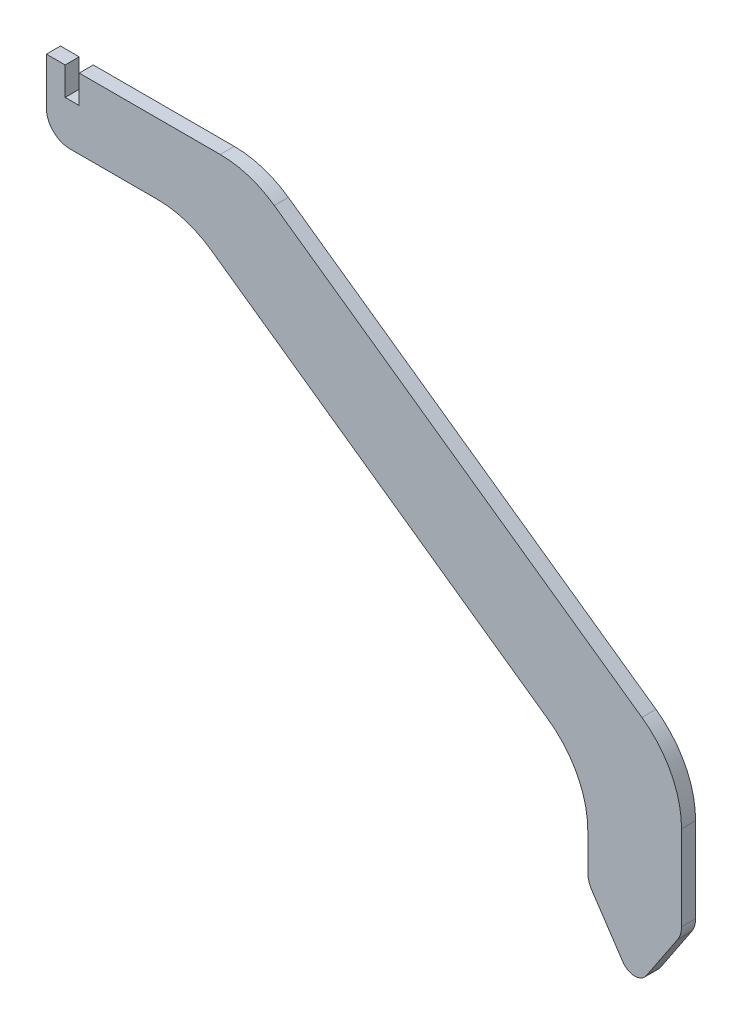
ISO-10303-21;
HEADER;
FILE_DESCRIPTION(('STEP AP214'),'2;1');
FILE_NAME('part.step','',(''),(''),'','','');
FILE_SCHEMA(('AUTOMOTIVE_DESIGN { 1 0 10303 214 1 1 1 1 }'));
ENDSEC;
DATA;
#1=APPLICATION_CONTEXT('core data for automotive mechanical design processes');
#2=APPLICATION_PROTOCOL_DEFINITION('international standard','automotive_design',2000,#1);
#3=PRODUCT_CONTEXT('',#1,'mechanical');
#4=PRODUCT('Part','Part','',(#3));
#5=PRODUCT_RELATED_PRODUCT_CATEGORY('part','',(#4));
#6=PRODUCT_DEFINITION_FORMATION('','',#4);
#7=PRODUCT_DEFINITION_CONTEXT('part definition',#1,'design');
#8=PRODUCT_DEFINITION('design','',#6,#7);
#9=PRODUCT_DEFINITION_SHAPE('','',#8);
#10=(LENGTH_UNIT() NAMED_UNIT(*) SI_UNIT(.MILLI.,.METRE.));
#11=(NAMED_UNIT(*) PLANE_ANGLE_UNIT() SI_UNIT($,.RADIAN.));
#12=(NAMED_UNIT(*) SI_UNIT($,.STERADIAN.) SOLID_ANGLE_UNIT());
#13=UNCERTAINTY_MEASURE_WITH_UNIT(LENGTH_MEASURE(1.E-05),#10,'distance_accuracy_value','');
#14=(GEOMETRIC_REPRESENTATION_CONTEXT(3) GLOBAL_UNCERTAINTY_ASSIGNED_CONTEXT((#13)) GLOBAL_UNIT_ASSIGNED_CONTEXT((#10,
#11,#12)) REPRESENTATION_CONTEXT('',''));
#15=CARTESIAN_POINT('',(0.,0.,0.));
#16=DIRECTION('',(0.,0.,1.));
#17=DIRECTION('',(1.,0.,0.));
#18=AXIS2_PLACEMENT_3D('',#15,#16,#17);
#19=CARTESIAN_POINT('',(0.,-1.5,0.15));
#20=DIRECTION('',(1.,0.,0.));
#21=DIRECTION('',(0.,0.,-1.));
#22=AXIS2_PLACEMENT_3D('',#19,#20,#21);
#23=PLANE('',#22);
#24=DIRECTION('',(0.,-1.,0.));
#25=VECTOR('',#24,1.);
#26=CARTESIAN_POINT('',(0.,-1.5,-0.15));
#27=LINE('',#26,#25);
#28=CARTESIAN_POINT('',(0.,0.,-0.15));
#29=VERTEX_POINT('',#28);
#30=CARTESIAN_POINT('',(0.,-1.,-0.15));
#31=VERTEX_POINT('',#30);
#32=EDGE_CURVE('E221',#29,#31,#27,.T.);
#33=ORIENTED_EDGE('',*,*,#32,.T.);
#34=DIRECTION('',(0.,0.,-1.));
#35=VECTOR('',#34,1.);
#36=CARTESIAN_POINT('',(0.,-1.,0.15));
#37=LINE('',#36,#35);
#38=CARTESIAN_POINT('',(0.,-1.,0.15));
#39=VERTEX_POINT('',#38);
#40=EDGE_CURVE('E289',#31,#39,#37,.F.);
#41=ORIENTED_EDGE('',*,*,#40,.T.);
#42=DIRECTION('',(0.,-1.,0.));
#43=VECTOR('',#42,1.);
#44=CARTESIAN_POINT('',(0.,-1.5,0.15));
#45=LINE('',#44,#43);
#46=CARTESIAN_POINT('',(0.,0.,0.15));
#47=VERTEX_POINT('',#46);
#48=EDGE_CURVE('E256',#47,#39,#45,.T.);
#49=ORIENTED_EDGE('',*,*,#48,.F.);
#50=DIRECTION('',(0.,0.,-1.));
#51=VECTOR('',#50,1.);
#52=CARTESIAN_POINT('',(0.,0.,0.15));
#53=LINE('',#52,#51);
#54=EDGE_CURVE('E220',#47,#29,#53,.T.);
#55=ORIENTED_EDGE('',*,*,#54,.T.);
#56=EDGE_LOOP('',(#33,#41,#49,#55));
#57=FACE_BOUND('',#56,.T.);
#58=ADVANCED_FACE('F37',(#57),#23,.F.);
#59=CARTESIAN_POINT('',(3.,-1.5,0.15));
#60=DIRECTION('',(0.,1.,0.));
#61=DIRECTION('',(-1.,0.,0.));
#62=AXIS2_PLACEMENT_3D('',#59,#60,#61);
#63=PLANE('',#62);
#64=DIRECTION('',(1.,0.,0.));
#65=VECTOR('',#64,1.);
#66=CARTESIAN_POINT('',(3.,-1.5,-0.15));
#67=LINE('',#66,#65);
#68=CARTESIAN_POINT('',(0.5,-1.5,-0.15));
#69=VERTEX_POINT('',#68);
#70=CARTESIAN_POINT('',(2.36514507852952,-1.5,-0.15));
#71=VERTEX_POINT('',#70);
#72=EDGE_CURVE('E225',#69,#71,#67,.T.);
#73=ORIENTED_EDGE('',*,*,#72,.T.);
#74=DIRECTION('',(0.,0.,-1.));
#75=VECTOR('',#74,1.);
#76=CARTESIAN_POINT('',(2.36514507852952,-1.5,0.15));
#77=LINE('',#76,#75);
#78=CARTESIAN_POINT('',(2.36514507852952,-1.5,0.15));
#79=VERTEX_POINT('',#78);
#80=EDGE_CURVE('E332',#71,#79,#77,.F.);
#81=ORIENTED_EDGE('',*,*,#80,.T.);
#82=DIRECTION('',(1.,0.,0.));
#83=VECTOR('',#82,1.);
#84=CARTESIAN_POINT('',(3.,-1.5,0.15));
#85=LINE('',#84,#83);
#86=CARTESIAN_POINT('',(0.5,-1.5,0.15));
#87=VERTEX_POINT('',#86);
#88=EDGE_CURVE('E351',#87,#79,#85,.T.);
#89=ORIENTED_EDGE('',*,*,#88,.F.);
#90=DIRECTION('',(0.,0.,-1.));
#91=VECTOR('',#90,1.);
#92=CARTESIAN_POINT('',(0.5,-1.5,0.15));
#93=LINE('',#92,#91);
#94=EDGE_CURVE('E278',#87,#69,#93,.T.);
#95=ORIENTED_EDGE('',*,*,#94,.T.);
#96=EDGE_LOOP('',(#73,#81,#89,#95));
#97=FACE_BOUND('',#96,.T.);
#98=ADVANCED_FACE('F344',(#97),#63,.F.);
#99=CARTESIAN_POINT('',(11.55,-7.5362202999531,0.15));
#100=DIRECTION('',(0.5767422601275,0.816926168869025,0.));
#101=DIRECTION('',(-0.816926168869025,0.5767422601275,0.));
#102=AXIS2_PLACEMENT_3D('',#99,#100,#101);
#103=PLANE('',#102);
#104=DIRECTION('',(0.816926168869025,-0.5767422601275,0.));
#105=VECTOR('',#104,1.);
#106=CARTESIAN_POINT('',(11.55,-7.5362202999531,-0.15));
#107=LINE('',#106,#105);
#108=CARTESIAN_POINT('',(3.51862959878452,-1.86614766226195,-0.15));
#109=VERTEX_POINT('',#108);
#110=CARTESIAN_POINT('',(10.703484520255,-6.93858826216815,-0.15));
#111=VERTEX_POINT('',#110);
#112=EDGE_CURVE('E228',#109,#111,#107,.T.);
#113=ORIENTED_EDGE('',*,*,#112,.T.);
#114=DIRECTION('',(0.,0.,-1.));
#115=VECTOR('',#114,1.);
#116=CARTESIAN_POINT('',(10.703484520255,-6.93858826216815,0.15));
#117=LINE('',#116,#115);
#118=CARTESIAN_POINT('',(10.703484520255,-6.93858826216815,0.15));
#119=VERTEX_POINT('',#118);
#120=EDGE_CURVE('E330',#111,#119,#117,.F.);
#121=ORIENTED_EDGE('',*,*,#120,.T.);
#122=DIRECTION('',(0.816926168869025,-0.5767422601275,0.));
#123=VECTOR('',#122,1.);
#124=CARTESIAN_POINT('',(11.55,-7.5362202999531,0.15));
#125=LINE('',#124,#123);
#126=CARTESIAN_POINT('',(3.51862959878452,-1.86614766226195,0.15));
#127=VERTEX_POINT('',#126);
#128=EDGE_CURVE('E350',#127,#119,#125,.T.);
#129=ORIENTED_EDGE('',*,*,#128,.F.);
#130=DIRECTION('',(0.,0.,-1.));
#131=VECTOR('',#130,1.);
#132=CARTESIAN_POINT('',(3.51862959878452,-1.86614766226195,-0.15));
#133=LINE('',#132,#131);
#134=EDGE_CURVE('E327',#127,#109,#133,.T.);
#135=ORIENTED_EDGE('',*,*,#134,.T.);
#136=EDGE_LOOP('',(#113,#121,#129,#135));
#137=FACE_BOUND('',#136,.T.);
#138=ADVANCED_FACE('F353',(#137),#103,.F.);
#139=CARTESIAN_POINT('',(11.55,-9.5,0.15));
#140=DIRECTION('',(1.,0.,0.));
#141=DIRECTION('',(0.,0.,-1.));
#142=AXIS2_PLACEMENT_3D('',#139,#140,#141);
#143=PLANE('',#142);
#144=DIRECTION('',(0.,-1.,0.));
#145=VECTOR('',#144,1.);
#146=CARTESIAN_POINT('',(11.55,-9.5,0.15));
#147=LINE('',#146,#145);
#148=CARTESIAN_POINT('',(11.55,-8.5724405999062,0.15));
#149=VERTEX_POINT('',#148);
#150=CARTESIAN_POINT('',(11.55,-9.348612181134,0.15));
#151=VERTEX_POINT('',#150);
#152=EDGE_CURVE('E355',#149,#151,#147,.T.);
#153=ORIENTED_EDGE('',*,*,#152,.F.);
#154=DIRECTION('',(0.,0.,-1.));
#155=VECTOR('',#154,1.);
#156=CARTESIAN_POINT('',(11.55,-8.5724405999062,-0.15));
#157=LINE('',#156,#155);
#158=CARTESIAN_POINT('',(11.55,-8.5724405999062,-0.15));
#159=VERTEX_POINT('',#158);
#160=EDGE_CURVE('E324',#149,#159,#157,.T.);
#161=ORIENTED_EDGE('',*,*,#160,.T.);
#162=DIRECTION('',(0.,-1.,0.));
#163=VECTOR('',#162,1.);
#164=CARTESIAN_POINT('',(11.55,-9.5,-0.15));
#165=LINE('',#164,#163);
#166=CARTESIAN_POINT('',(11.55,-9.348612181134,-0.15));
#167=VERTEX_POINT('',#166);
#168=EDGE_CURVE('E231',#159,#167,#165,.T.);
#169=ORIENTED_EDGE('',*,*,#168,.T.);
#170=DIRECTION('',(0.,0.,-1.));
#171=VECTOR('',#170,1.);
#172=CARTESIAN_POINT('',(11.55,-9.348612181134,0.15));
#173=LINE('',#172,#171);
#174=EDGE_CURVE('E306',#167,#151,#173,.F.);
#175=ORIENTED_EDGE('',*,*,#174,.T.);
#176=EDGE_LOOP('',(#153,#161,#169,#175));
#177=FACE_BOUND('',#176,.T.);
#178=ADVANCED_FACE('F419',(#177),#143,.F.);
#179=CARTESIAN_POINT('',(12.55,-11.,0.15));
#180=DIRECTION('',(0.832050294337844,0.554700196225229,0.));
#181=DIRECTION('',(-0.554700196225229,0.832050294337844,0.));
#182=AXIS2_PLACEMENT_3D('',#179,#180,#181);
#183=PLANE('',#182);
#184=DIRECTION('',(0.554700196225229,-0.832050294337844,0.));
#185=VECTOR('',#184,1.);
#186=CARTESIAN_POINT('',(12.55,-11.,0.15));
#187=LINE('',#186,#185);
#188=CARTESIAN_POINT('',(11.6339748528311,-9.62596227924662,0.15));
#189=VERTEX_POINT('',#188);
#190=CARTESIAN_POINT('',(12.3003849116986,-10.625577367548,0.15));
#191=VERTEX_POINT('',#190);
#192=EDGE_CURVE('E357',#189,#191,#187,.T.);
#193=ORIENTED_EDGE('',*,*,#192,.F.);
#194=DIRECTION('',(0.,0.,-1.));
#195=VECTOR('',#194,1.);
#196=CARTESIAN_POINT('',(11.6339748528311,-9.62596227924662,0.15));
#197=LINE('',#196,#195);
#198=CARTESIAN_POINT('',(11.6339748528311,-9.62596227924662,-0.15));
#199=VERTEX_POINT('',#198);
#200=EDGE_CURVE('E303',#189,#199,#197,.T.);
#201=ORIENTED_EDGE('',*,*,#200,.T.);
#202=DIRECTION('',(0.554700196225229,-0.832050294337844,0.));
#203=VECTOR('',#202,1.);
#204=CARTESIAN_POINT('',(12.55,-11.,-0.15));
#205=LINE('',#204,#203);
#206=CARTESIAN_POINT('',(12.3003849116986,-10.625577367548,-0.15));
#207=VERTEX_POINT('',#206);
#208=EDGE_CURVE('E233',#199,#207,#205,.T.);
#209=ORIENTED_EDGE('',*,*,#208,.T.);
#210=DIRECTION('',(0.,0.,-1.));
#211=VECTOR('',#210,1.);
#212=CARTESIAN_POINT('',(12.3003849116986,-10.625577367548,0.15));
#213=LINE('',#212,#211);
#214=EDGE_CURVE('E273',#207,#191,#213,.F.);
#215=ORIENTED_EDGE('',*,*,#214,.T.);
#216=EDGE_LOOP('',(#193,#201,#209,#215));
#217=FACE_BOUND('',#216,.T.);
#218=ADVANCED_FACE('F422',(#217),#183,.F.);
#219=CARTESIAN_POINT('',(13.55,-9.5,0.15));
#220=DIRECTION('',(-0.832050294337844,0.554700196225229,0.));
#221=DIRECTION('',(-0.554700196225229,-0.832050294337844,0.));
#222=AXIS2_PLACEMENT_3D('',#219,#220,#221);
#223=PLANE('',#222);
#224=DIRECTION('',(0.554700196225229,0.832050294337844,0.));
#225=VECTOR('',#224,1.);
#226=CARTESIAN_POINT('',(13.55,-9.5,-0.15));
#227=LINE('',#226,#225);
#228=CARTESIAN_POINT('',(12.7996150883014,-10.625577367548,-0.15));
#229=VERTEX_POINT('',#228);
#230=CARTESIAN_POINT('',(13.4660251471689,-9.62596227924662,-0.15));
#231=VERTEX_POINT('',#230);
#232=EDGE_CURVE('E235',#229,#231,#227,.T.);
#233=ORIENTED_EDGE('',*,*,#232,.T.);
#234=DIRECTION('',(0.,0.,-1.));
#235=VECTOR('',#234,1.);
#236=CARTESIAN_POINT('',(13.4660251471689,-9.62596227924662,0.15));
#237=LINE('',#236,#235);
#238=CARTESIAN_POINT('',(13.4660251471689,-9.62596227924662,0.15));
#239=VERTEX_POINT('',#238);
#240=EDGE_CURVE('E301',#231,#239,#237,.F.);
#241=ORIENTED_EDGE('',*,*,#240,.T.);
#242=DIRECTION('',(0.554700196225229,0.832050294337844,0.));
#243=VECTOR('',#242,1.);
#244=CARTESIAN_POINT('',(13.55,-9.5,0.15));
#245=LINE('',#244,#243);
#246=CARTESIAN_POINT('',(12.7996150883014,-10.625577367548,0.15));
#247=VERTEX_POINT('',#246);
#248=EDGE_CURVE('E363',#247,#239,#245,.T.);
#249=ORIENTED_EDGE('',*,*,#248,.F.);
#250=DIRECTION('',(0.,0.,-1.));
#251=VECTOR('',#250,1.);
#252=CARTESIAN_POINT('',(12.7996150883014,-10.625577367548,0.15));
#253=LINE('',#252,#251);
#254=EDGE_CURVE('E205',#247,#229,#253,.T.);
#255=ORIENTED_EDGE('',*,*,#254,.T.);
#256=EDGE_LOOP('',(#233,#241,#249,#255));
#257=FACE_BOUND('',#256,.T.);
#258=ADVANCED_FACE('F426',(#257),#223,.F.);
#259=CARTESIAN_POINT('',(13.55,-6.5,0.15));
#260=DIRECTION('',(-1.,0.,0.));
#261=DIRECTION('',(0.,0.,1.));
#262=AXIS2_PLACEMENT_3D('',#259,#260,#261);
#263=PLANE('',#262);
#264=DIRECTION('',(0.,1.,0.));
#265=VECTOR('',#264,1.);
#266=CARTESIAN_POINT('',(13.55,-6.5,-0.15));
#267=LINE('',#266,#265);
#268=CARTESIAN_POINT('',(13.55,-9.348612181134,-0.15));
#269=VERTEX_POINT('',#268);
#270=CARTESIAN_POINT('',(13.55,-7.5362202999531,-0.15));
#271=VERTEX_POINT('',#270);
#272=EDGE_CURVE('E238',#269,#271,#267,.T.);
#273=ORIENTED_EDGE('',*,*,#272,.T.);
#274=DIRECTION('',(0.,0.,-1.));
#275=VECTOR('',#274,1.);
#276=CARTESIAN_POINT('',(13.55,-7.5362202999531,0.15));
#277=LINE('',#276,#275);
#278=CARTESIAN_POINT('',(13.55,-7.5362202999531,0.15));
#279=VERTEX_POINT('',#278);
#280=EDGE_CURVE('E52',#271,#279,#277,.F.);
#281=ORIENTED_EDGE('',*,*,#280,.T.);
#282=DIRECTION('',(0.,1.,0.));
#283=VECTOR('',#282,1.);
#284=CARTESIAN_POINT('',(13.55,-6.5,0.15));
#285=LINE('',#284,#283);
#286=CARTESIAN_POINT('',(13.55,-9.348612181134,0.15));
#287=VERTEX_POINT('',#286);
#288=EDGE_CURVE('E366',#287,#279,#285,.T.);
#289=ORIENTED_EDGE('',*,*,#288,.F.);
#290=DIRECTION('',(0.,0.,-1.));
#291=VECTOR('',#290,1.);
#292=CARTESIAN_POINT('',(13.55,-9.348612181134,0.15));
#293=LINE('',#292,#291);
#294=EDGE_CURVE('E298',#287,#269,#293,.T.);
#295=ORIENTED_EDGE('',*,*,#294,.T.);
#296=EDGE_LOOP('',(#273,#281,#289,#295));
#297=FACE_BOUND('',#296,.T.);
#298=ADVANCED_FACE('F430',(#297),#263,.F.);
#299=CARTESIAN_POINT('',(4.34307956993687,0.,0.15));
#300=DIRECTION('',(-0.5767422601275,-0.816926168869025,0.));
#301=DIRECTION('',(0.816926168869025,-0.5767422601275,0.));
#302=AXIS2_PLACEMENT_3D('',#299,#300,#301);
#303=PLANE('',#302);
#304=DIRECTION('',(-0.816926168869025,0.5767422601275,0.));
#305=VECTOR('',#304,1.);
#306=CARTESIAN_POINT('',(4.34307956993687,0.,-0.15));
#307=LINE('',#306,#305);
#308=CARTESIAN_POINT('',(12.703484520255,-5.90236796221505,-0.15));
#309=VERTEX_POINT('',#308);
#310=CARTESIAN_POINT('',(4.86170916872139,-0.36614766226195,-0.15));
#311=VERTEX_POINT('',#310);
#312=EDGE_CURVE('E240',#309,#311,#307,.T.);
#313=ORIENTED_EDGE('',*,*,#312,.T.);
#314=DIRECTION('',(0.,0.,-1.));
#315=VECTOR('',#314,1.);
#316=CARTESIAN_POINT('',(4.8617091687214,-0.36614766226195,0.15));
#317=LINE('',#316,#315);
#318=CARTESIAN_POINT('',(4.86170916872139,-0.36614766226195,0.15));
#319=VERTEX_POINT('',#318);
#320=EDGE_CURVE('E318',#311,#319,#317,.F.);
#321=ORIENTED_EDGE('',*,*,#320,.T.);
#322=DIRECTION('',(-0.816926168869025,0.5767422601275,0.));
#323=VECTOR('',#322,1.);
#324=CARTESIAN_POINT('',(4.34307956993687,0.,0.15));
#325=LINE('',#324,#323);
#326=CARTESIAN_POINT('',(12.703484520255,-5.90236796221505,0.15));
#327=VERTEX_POINT('',#326);
#328=EDGE_CURVE('E196',#327,#319,#325,.T.);
#329=ORIENTED_EDGE('',*,*,#328,.F.);
#330=DIRECTION('',(0.,0.,-1.));
#331=VECTOR('',#330,1.);
#332=CARTESIAN_POINT('',(12.703484520255,-5.90236796221505,0.15));
#333=LINE('',#332,#331);
#334=EDGE_CURVE('E315',#327,#309,#333,.T.);
#335=ORIENTED_EDGE('',*,*,#334,.T.);
#336=EDGE_LOOP('',(#313,#321,#329,#335));
#337=FACE_BOUND('',#336,.T.);
#338=ADVANCED_FACE('F434',(#337),#303,.F.);
#339=CARTESIAN_POINT('',(0.7,0.,0.15));
#340=DIRECTION('',(0.,-1.,0.));
#341=DIRECTION('',(0.,0.,-1.));
#342=AXIS2_PLACEMENT_3D('',#339,#340,#341);
#343=PLANE('',#342);
#344=DIRECTION('',(-1.,0.,0.));
#345=VECTOR('',#344,1.);
#346=CARTESIAN_POINT('',(0.7,0.,0.15));
#347=LINE('',#346,#345);
#348=CARTESIAN_POINT('',(3.70822464846639,0.,0.15));
#349=VERTEX_POINT('',#348);
#350=CARTESIAN_POINT('',(0.7,0.,0.15));
#351=VERTEX_POINT('',#350);
#352=EDGE_CURVE('E183',#349,#351,#347,.T.);
#353=ORIENTED_EDGE('',*,*,#352,.F.);
#354=DIRECTION('',(0.,0.,-1.));
#355=VECTOR('',#354,1.);
#356=CARTESIAN_POINT('',(3.70822464846639,0.,0.15));
#357=LINE('',#356,#355);
#358=CARTESIAN_POINT('',(3.70822464846639,0.,-0.15));
#359=VERTEX_POINT('',#358);
#360=EDGE_CURVE('E309',#349,#359,#357,.T.);
#361=ORIENTED_EDGE('',*,*,#360,.T.);
#362=DIRECTION('',(-1.,0.,0.));
#363=VECTOR('',#362,1.);
#364=CARTESIAN_POINT('',(0.7,0.,-0.15));
#365=LINE('',#364,#363);
#366=CARTESIAN_POINT('',(0.7,0.,-0.15));
#367=VERTEX_POINT('',#366);
#368=EDGE_CURVE('E202',#359,#367,#365,.T.);
#369=ORIENTED_EDGE('',*,*,#368,.T.);
#370=DIRECTION('',(0.,0.,-1.));
#371=VECTOR('',#370,1.);
#372=CARTESIAN_POINT('',(0.7,0.,0.15));
#373=LINE('',#372,#371);
#374=EDGE_CURVE('E199',#351,#367,#373,.T.);
#375=ORIENTED_EDGE('',*,*,#374,.F.);
#376=EDGE_LOOP('',(#353,#361,#369,#375));
#377=FACE_BOUND('',#376,.T.);
#378=ADVANCED_FACE('F200',(#377),#343,.F.);
#379=CARTESIAN_POINT('',(0.7,-0.6,0.15));
#380=DIRECTION('',(1.,0.,0.));
#381=DIRECTION('',(0.,1.,0.));
#382=AXIS2_PLACEMENT_3D('',#379,#380,#381);
#383=PLANE('',#382);
#384=DIRECTION('',(0.,-1.,0.));
#385=VECTOR('',#384,1.);
#386=CARTESIAN_POINT('',(0.7,-0.6,-0.15));
#387=LINE('',#386,#385);
#388=CARTESIAN_POINT('',(0.7,-0.6,-0.15));
#389=VERTEX_POINT('',#388);
#390=EDGE_CURVE('E245',#367,#389,#387,.T.);
#391=ORIENTED_EDGE('',*,*,#390,.T.);
#392=DIRECTION('',(0.,0.,-1.));
#393=VECTOR('',#392,1.);
#394=CARTESIAN_POINT('',(0.7,-0.6,0.15));
#395=LINE('',#394,#393);
#396=CARTESIAN_POINT('',(0.7,-0.6,0.15));
#397=VERTEX_POINT('',#396);
#398=EDGE_CURVE('E206',#397,#389,#395,.T.);
#399=ORIENTED_EDGE('',*,*,#398,.F.);
#400=DIRECTION('',(0.,-1.,0.));
#401=VECTOR('',#400,1.);
#402=CARTESIAN_POINT('',(0.7,-0.6,0.15));
#403=LINE('',#402,#401);
#404=EDGE_CURVE('E188',#351,#397,#403,.T.);
#405=ORIENTED_EDGE('',*,*,#404,.F.);
#406=ORIENTED_EDGE('',*,*,#374,.T.);
#407=EDGE_LOOP('',(#391,#399,#405,#406));
#408=FACE_BOUND('',#407,.T.);
#409=ADVANCED_FACE('F208',(#408),#383,.F.);
#410=CARTESIAN_POINT('',(0.4,-0.6,0.15));
#411=DIRECTION('',(0.,-1.,0.));
#412=DIRECTION('',(0.,0.,-1.));
#413=AXIS2_PLACEMENT_3D('',#410,#411,#412);
#414=PLANE('',#413);
#415=DIRECTION('',(-1.,0.,0.));
#416=VECTOR('',#415,1.);
#417=CARTESIAN_POINT('',(0.4,-0.6,-0.15));
#418=LINE('',#417,#416);
#419=CARTESIAN_POINT('',(0.4,-0.6,-0.15));
#420=VERTEX_POINT('',#419);
#421=EDGE_CURVE('E247',#389,#420,#418,.T.);
#422=ORIENTED_EDGE('',*,*,#421,.T.);
#423=DIRECTION('',(0.,0.,-1.));
#424=VECTOR('',#423,1.);
#425=CARTESIAN_POINT('',(0.4,-0.6,0.15));
#426=LINE('',#425,#424);
#427=CARTESIAN_POINT('',(0.4,-0.6,0.15));
#428=VERTEX_POINT('',#427);
#429=EDGE_CURVE('E263',#428,#420,#426,.T.);
#430=ORIENTED_EDGE('',*,*,#429,.F.);
#431=DIRECTION('',(-1.,0.,0.));
#432=VECTOR('',#431,1.);
#433=CARTESIAN_POINT('',(0.4,-0.6,0.15));
#434=LINE('',#433,#432);
#435=EDGE_CURVE('E211',#397,#428,#434,.T.);
#436=ORIENTED_EDGE('',*,*,#435,.F.);
#437=ORIENTED_EDGE('',*,*,#398,.T.);
#438=EDGE_LOOP('',(#422,#430,#436,#437));
#439=FACE_BOUND('',#438,.T.);
#440=ADVANCED_FACE('F378',(#439),#414,.F.);
#441=CARTESIAN_POINT('',(0.4,0.,0.15));
#442=DIRECTION('',(-1.,0.,0.));
#443=DIRECTION('',(0.,-1.,0.));
#444=AXIS2_PLACEMENT_3D('',#441,#442,#443);
#445=PLANE('',#444);
#446=DIRECTION('',(0.,1.,0.));
#447=VECTOR('',#446,1.);
#448=CARTESIAN_POINT('',(0.4,0.,-0.15));
#449=LINE('',#448,#447);
#450=CARTESIAN_POINT('',(0.4,0.,-0.15));
#451=VERTEX_POINT('',#450);
#452=EDGE_CURVE('E250',#420,#451,#449,.T.);
#453=ORIENTED_EDGE('',*,*,#452,.T.);
#454=DIRECTION('',(0.,0.,-1.));
#455=VECTOR('',#454,1.);
#456=CARTESIAN_POINT('',(0.4,0.,0.15));
#457=LINE('',#456,#455);
#458=CARTESIAN_POINT('',(0.4,0.,0.15));
#459=VERTEX_POINT('',#458);
#460=EDGE_CURVE('E260',#459,#451,#457,.T.);
#461=ORIENTED_EDGE('',*,*,#460,.F.);
#462=DIRECTION('',(0.,1.,0.));
#463=VECTOR('',#462,1.);
#464=CARTESIAN_POINT('',(0.4,0.,0.15));
#465=LINE('',#464,#463);
#466=EDGE_CURVE('E213',#428,#459,#465,.T.);
#467=ORIENTED_EDGE('',*,*,#466,.F.);
#468=ORIENTED_EDGE('',*,*,#429,.T.);
#469=EDGE_LOOP('',(#453,#461,#467,#468));
#470=FACE_BOUND('',#469,.T.);
#471=ADVANCED_FACE('F386',(#470),#445,.F.);
#472=CARTESIAN_POINT('',(0.,0.,0.15));
#473=DIRECTION('',(0.,-1.,0.));
#474=DIRECTION('',(0.,0.,-1.));
#475=AXIS2_PLACEMENT_3D('',#472,#473,#474);
#476=PLANE('',#475);
#477=DIRECTION('',(-1.,0.,0.));
#478=VECTOR('',#477,1.);
#479=CARTESIAN_POINT('',(0.,0.,-0.15));
#480=LINE('',#479,#478);
#481=EDGE_CURVE('E253',#451,#29,#480,.T.);
#482=ORIENTED_EDGE('',*,*,#481,.T.);
#483=ORIENTED_EDGE('',*,*,#54,.F.);
#484=DIRECTION('',(-1.,0.,0.));
#485=VECTOR('',#484,1.);
#486=CARTESIAN_POINT('',(0.,0.,0.15));
#487=LINE('',#486,#485);
#488=EDGE_CURVE('E218',#459,#47,#487,.T.);
#489=ORIENTED_EDGE('',*,*,#488,.F.);
#490=ORIENTED_EDGE('',*,*,#460,.T.);
#491=EDGE_LOOP('',(#482,#483,#489,#490));
#492=FACE_BOUND('',#491,.T.);
#493=ADVANCED_FACE('F389',(#492),#476,.F.);
#494=CARTESIAN_POINT('',(0.,0.,0.15));
#495=DIRECTION('',(0.,0.,-1.));
#496=DIRECTION('',(-1.,0.,0.));
#497=AXIS2_PLACEMENT_3D('',#494,#495,#496);
#498=PLANE('',#497);
#499=ORIENTED_EDGE('',*,*,#328,.T.);
#500=CARTESIAN_POINT('',(3.70822464846639,-2.,0.15));
#501=DIRECTION('',(0.,0.,-1.));
#502=DIRECTION('',(-1.,0.,0.));
#503=AXIS2_PLACEMENT_3D('',#500,#501,#502);
#504=CIRCLE('',#503,2.);
#505=EDGE_CURVE('E191',#319,#349,#504,.F.);
#506=ORIENTED_EDGE('',*,*,#505,.T.);
#507=ORIENTED_EDGE('',*,*,#352,.T.);
#508=ORIENTED_EDGE('',*,*,#404,.T.);
#509=ORIENTED_EDGE('',*,*,#435,.T.);
#510=ORIENTED_EDGE('',*,*,#466,.T.);
#511=ORIENTED_EDGE('',*,*,#488,.T.);
#512=ORIENTED_EDGE('',*,*,#48,.T.);
#513=CARTESIAN_POINT('',(0.5,-1.,0.15));
#514=DIRECTION('',(0.,0.,-1.));
#515=DIRECTION('',(-1.,0.,0.));
#516=AXIS2_PLACEMENT_3D('',#513,#514,#515);
#517=CIRCLE('',#516,0.5);
#518=EDGE_CURVE('E296',#39,#87,#517,.F.);
#519=ORIENTED_EDGE('',*,*,#518,.T.);
#520=ORIENTED_EDGE('',*,*,#88,.T.);
#521=CARTESIAN_POINT('',(2.36514507852952,-3.5,0.15));
#522=DIRECTION('',(0.,0.,-1.));
#523=DIRECTION('',(-1.,0.,0.));
#524=AXIS2_PLACEMENT_3D('',#521,#522,#523);
#525=CIRCLE('',#524,2.);
#526=EDGE_CURVE('E11',#79,#127,#525,.T.);
#527=ORIENTED_EDGE('',*,*,#526,.T.);
#528=ORIENTED_EDGE('',*,*,#128,.T.);
#529=CARTESIAN_POINT('',(9.55,-8.5724405999062,0.15));
#530=DIRECTION('',(0.,0.,-1.));
#531=DIRECTION('',(-1.,0.,0.));
#532=AXIS2_PLACEMENT_3D('',#529,#530,#531);
#533=CIRCLE('',#532,2.);
#534=EDGE_CURVE('E60',#119,#149,#533,.T.);
#535=ORIENTED_EDGE('',*,*,#534,.T.);
#536=ORIENTED_EDGE('',*,*,#152,.T.);
#537=CARTESIAN_POINT('',(12.05,-9.348612181134,0.15));
#538=DIRECTION('',(0.,0.,-1.));
#539=DIRECTION('',(-1.,0.,0.));
#540=AXIS2_PLACEMENT_3D('',#537,#538,#539);
#541=CIRCLE('',#540,0.5);
#542=EDGE_CURVE('E292',#151,#189,#541,.F.);
#543=ORIENTED_EDGE('',*,*,#542,.T.);
#544=ORIENTED_EDGE('',*,*,#192,.T.);
#545=CARTESIAN_POINT('',(12.55,-10.4591673086804,0.15));
#546=DIRECTION('',(0.,0.,-1.));
#547=DIRECTION('',(-1.,0.,0.));
#548=AXIS2_PLACEMENT_3D('',#545,#546,#547);
#549=CIRCLE('',#548,0.3);
#550=EDGE_CURVE('E276',#191,#247,#549,.F.);
#551=ORIENTED_EDGE('',*,*,#550,.T.);
#552=ORIENTED_EDGE('',*,*,#248,.T.);
#553=CARTESIAN_POINT('',(13.05,-9.348612181134,0.15));
#554=DIRECTION('',(0.,0.,-1.));
#555=DIRECTION('',(-1.,0.,0.));
#556=AXIS2_PLACEMENT_3D('',#553,#554,#555);
#557=CIRCLE('',#556,0.5);
#558=EDGE_CURVE('E294',#239,#287,#557,.F.);
#559=ORIENTED_EDGE('',*,*,#558,.T.);
#560=ORIENTED_EDGE('',*,*,#288,.T.);
#561=CARTESIAN_POINT('',(11.55,-7.5362202999531,0.15));
#562=DIRECTION('',(0.,0.,-1.));
#563=DIRECTION('',(-1.,0.,0.));
#564=AXIS2_PLACEMENT_3D('',#561,#562,#563);
#565=CIRCLE('',#564,2.);
#566=EDGE_CURVE('E320',#279,#327,#565,.F.);
#567=ORIENTED_EDGE('',*,*,#566,.T.);
#568=EDGE_LOOP('',(#499,#506,#507,#508,#509,#510,#511,#512,#519,#520,#527,#528,#535,#536,#543,
#544,#551,#552,#559,#560,#567));
#569=FACE_BOUND('',#568,.T.);
#570=ADVANCED_FACE('F186',(#569),#498,.F.);
#571=CARTESIAN_POINT('',(0.,0.,-0.15));
#572=DIRECTION('',(0.,0.,-1.));
#573=DIRECTION('',(-1.,0.,0.));
#574=AXIS2_PLACEMENT_3D('',#571,#572,#573);
#575=PLANE('',#574);
#576=ORIENTED_EDGE('',*,*,#368,.F.);
#577=CARTESIAN_POINT('',(3.70822464846639,-2.,-0.15));
#578=DIRECTION('',(0.,0.,-1.));
#579=DIRECTION('',(-1.,0.,0.));
#580=AXIS2_PLACEMENT_3D('',#577,#578,#579);
#581=CIRCLE('',#580,2.);
#582=EDGE_CURVE('E313',#359,#311,#581,.T.);
#583=ORIENTED_EDGE('',*,*,#582,.T.);
#584=ORIENTED_EDGE('',*,*,#312,.F.);
#585=CARTESIAN_POINT('',(11.55,-7.5362202999531,-0.15));
#586=DIRECTION('',(0.,0.,-1.));
#587=DIRECTION('',(-1.,0.,0.));
#588=AXIS2_PLACEMENT_3D('',#585,#586,#587);
#589=CIRCLE('',#588,2.);
#590=EDGE_CURVE('E311',#309,#271,#589,.T.);
#591=ORIENTED_EDGE('',*,*,#590,.T.);
#592=ORIENTED_EDGE('',*,*,#272,.F.);
#593=CARTESIAN_POINT('',(13.05,-9.348612181134,-0.15));
#594=DIRECTION('',(0.,0.,-1.));
#595=DIRECTION('',(-1.,0.,0.));
#596=AXIS2_PLACEMENT_3D('',#593,#594,#595);
#597=CIRCLE('',#596,0.5);
#598=EDGE_CURVE('E284',#269,#231,#597,.T.);
#599=ORIENTED_EDGE('',*,*,#598,.T.);
#600=ORIENTED_EDGE('',*,*,#232,.F.);
#601=CARTESIAN_POINT('',(12.55,-10.4591673086804,-0.15));
#602=DIRECTION('',(0.,0.,-1.));
#603=DIRECTION('',(-1.,0.,0.));
#604=AXIS2_PLACEMENT_3D('',#601,#602,#603);
#605=CIRCLE('',#604,0.3);
#606=EDGE_CURVE('E270',#229,#207,#605,.T.);
#607=ORIENTED_EDGE('',*,*,#606,.T.);
#608=ORIENTED_EDGE('',*,*,#208,.F.);
#609=CARTESIAN_POINT('',(12.05,-9.348612181134,-0.15));
#610=DIRECTION('',(0.,0.,-1.));
#611=DIRECTION('',(-1.,0.,0.));
#612=AXIS2_PLACEMENT_3D('',#609,#610,#611);
#613=CIRCLE('',#612,0.5);
#614=EDGE_CURVE('E281',#199,#167,#613,.T.);
#615=ORIENTED_EDGE('',*,*,#614,.T.);
#616=ORIENTED_EDGE('',*,*,#168,.F.);
#617=CARTESIAN_POINT('',(9.55,-8.5724405999062,-0.15));
#618=DIRECTION('',(0.,0.,-1.));
#619=DIRECTION('',(-1.,0.,0.));
#620=AXIS2_PLACEMENT_3D('',#617,#618,#619);
#621=CIRCLE('',#620,2.);
#622=EDGE_CURVE('E334',#159,#111,#621,.F.);
#623=ORIENTED_EDGE('',*,*,#622,.T.);
#624=ORIENTED_EDGE('',*,*,#112,.F.);
#625=CARTESIAN_POINT('',(2.36514507852952,-3.5,-0.15));
#626=DIRECTION('',(0.,0.,-1.));
#627=DIRECTION('',(-1.,0.,0.));
#628=AXIS2_PLACEMENT_3D('',#625,#626,#627);
#629=CIRCLE('',#628,2.);
#630=EDGE_CURVE('E45',#109,#71,#629,.F.);
#631=ORIENTED_EDGE('',*,*,#630,.T.);
#632=ORIENTED_EDGE('',*,*,#72,.F.);
#633=CARTESIAN_POINT('',(0.5,-1.,-0.15));
#634=DIRECTION('',(0.,0.,-1.));
#635=DIRECTION('',(-1.,0.,0.));
#636=AXIS2_PLACEMENT_3D('',#633,#634,#635);
#637=CIRCLE('',#636,0.5);
#638=EDGE_CURVE('E286',#69,#31,#637,.T.);
#639=ORIENTED_EDGE('',*,*,#638,.T.);
#640=ORIENTED_EDGE('',*,*,#32,.F.);
#641=ORIENTED_EDGE('',*,*,#481,.F.);
#642=ORIENTED_EDGE('',*,*,#452,.F.);
#643=ORIENTED_EDGE('',*,*,#421,.F.);
#644=ORIENTED_EDGE('',*,*,#390,.F.);
#645=EDGE_LOOP('',(#576,#583,#584,#591,#592,#599,#600,#607,#608,#615,#616,#623,#624,#631,#632,
#639,#640,#641,#642,#643,#644));
#646=FACE_BOUND('',#645,.T.);
#647=ADVANCED_FACE('F339',(#646),#575,.T.);
#648=CARTESIAN_POINT('',(12.55,-10.4591673086804,0.15));
#649=DIRECTION('',(0.,0.,-1.));
#650=DIRECTION('',(-1.,0.,0.));
#651=AXIS2_PLACEMENT_3D('',#648,#649,#650);
#652=CYLINDRICAL_SURFACE('',#651,0.3);
#653=ORIENTED_EDGE('',*,*,#550,.F.);
#654=ORIENTED_EDGE('',*,*,#214,.F.);
#655=ORIENTED_EDGE('',*,*,#606,.F.);
#656=ORIENTED_EDGE('',*,*,#254,.F.);
#657=EDGE_LOOP('',(#653,#654,#655,#656));
#658=FACE_BOUND('',#657,.T.);
#659=ADVANCED_FACE('F399',(#658),#652,.T.);
#660=CARTESIAN_POINT('',(0.5,-1.,0.15));
#661=DIRECTION('',(0.,0.,-1.));
#662=DIRECTION('',(-1.,0.,0.));
#663=AXIS2_PLACEMENT_3D('',#660,#661,#662);
#664=CYLINDRICAL_SURFACE('',#663,0.5);
#665=ORIENTED_EDGE('',*,*,#518,.F.);
#666=ORIENTED_EDGE('',*,*,#40,.F.);
#667=ORIENTED_EDGE('',*,*,#638,.F.);
#668=ORIENTED_EDGE('',*,*,#94,.F.);
#669=EDGE_LOOP('',(#665,#666,#667,#668));
#670=FACE_BOUND('',#669,.T.);
#671=ADVANCED_FACE('F396',(#670),#664,.T.);
#672=CARTESIAN_POINT('',(13.05,-9.348612181134,0.15));
#673=DIRECTION('',(0.,0.,-1.));
#674=DIRECTION('',(-1.,0.,0.));
#675=AXIS2_PLACEMENT_3D('',#672,#673,#674);
#676=CYLINDRICAL_SURFACE('',#675,0.5);
#677=ORIENTED_EDGE('',*,*,#558,.F.);
#678=ORIENTED_EDGE('',*,*,#240,.F.);
#679=ORIENTED_EDGE('',*,*,#598,.F.);
#680=ORIENTED_EDGE('',*,*,#294,.F.);
#681=EDGE_LOOP('',(#677,#678,#679,#680));
#682=FACE_BOUND('',#681,.T.);
#683=ADVANCED_FACE('F398',(#682),#676,.T.);
#684=CARTESIAN_POINT('',(12.05,-9.348612181134,0.15));
#685=DIRECTION('',(0.,0.,-1.));
#686=DIRECTION('',(-1.,0.,0.));
#687=AXIS2_PLACEMENT_3D('',#684,#685,#686);
#688=CYLINDRICAL_SURFACE('',#687,0.5);
#689=ORIENTED_EDGE('',*,*,#542,.F.);
#690=ORIENTED_EDGE('',*,*,#174,.F.);
#691=ORIENTED_EDGE('',*,*,#614,.F.);
#692=ORIENTED_EDGE('',*,*,#200,.F.);
#693=EDGE_LOOP('',(#689,#690,#691,#692));
#694=FACE_BOUND('',#693,.T.);
#695=ADVANCED_FACE('F405',(#694),#688,.T.);
#696=CARTESIAN_POINT('',(3.70822464846639,-2.,0.15));
#697=DIRECTION('',(0.,0.,-1.));
#698=DIRECTION('',(-1.,0.,0.));
#699=AXIS2_PLACEMENT_3D('',#696,#697,#698);
#700=CYLINDRICAL_SURFACE('',#699,2.);
#701=ORIENTED_EDGE('',*,*,#505,.F.);
#702=ORIENTED_EDGE('',*,*,#320,.F.);
#703=ORIENTED_EDGE('',*,*,#582,.F.);
#704=ORIENTED_EDGE('',*,*,#360,.F.);
#705=EDGE_LOOP('',(#701,#702,#703,#704));
#706=FACE_BOUND('',#705,.T.);
#707=ADVANCED_FACE('F373',(#706),#700,.T.);
#708=CARTESIAN_POINT('',(11.55,-7.5362202999531,0.15));
#709=DIRECTION('',(0.,0.,-1.));
#710=DIRECTION('',(-1.,0.,0.));
#711=AXIS2_PLACEMENT_3D('',#708,#709,#710);
#712=CYLINDRICAL_SURFACE('',#711,2.);
#713=ORIENTED_EDGE('',*,*,#566,.F.);
#714=ORIENTED_EDGE('',*,*,#280,.F.);
#715=ORIENTED_EDGE('',*,*,#590,.F.);
#716=ORIENTED_EDGE('',*,*,#334,.F.);
#717=EDGE_LOOP('',(#713,#714,#715,#716));
#718=FACE_BOUND('',#717,.T.);
#719=ADVANCED_FACE('F568',(#718),#712,.T.);
#720=CARTESIAN_POINT('',(9.55,-8.5724405999062,0.15));
#721=DIRECTION('',(0.,0.,1.));
#722=DIRECTION('',(1.,0.,0.));
#723=AXIS2_PLACEMENT_3D('',#720,#721,#722);
#724=CYLINDRICAL_SURFACE('',#723,2.);
#725=ORIENTED_EDGE('',*,*,#534,.F.);
#726=ORIENTED_EDGE('',*,*,#120,.F.);
#727=ORIENTED_EDGE('',*,*,#622,.F.);
#728=ORIENTED_EDGE('',*,*,#160,.F.);
#729=EDGE_LOOP('',(#725,#726,#727,#728));
#730=FACE_BOUND('',#729,.T.);
#731=ADVANCED_FACE('F574',(#730),#724,.F.);
#732=CARTESIAN_POINT('',(2.36514507852952,-3.5,0.15));
#733=DIRECTION('',(0.,0.,1.));
#734=DIRECTION('',(1.,0.,0.));
#735=AXIS2_PLACEMENT_3D('',#732,#733,#734);
#736=CYLINDRICAL_SURFACE('',#735,2.);
#737=ORIENTED_EDGE('',*,*,#526,.F.);
#738=ORIENTED_EDGE('',*,*,#80,.F.);
#739=ORIENTED_EDGE('',*,*,#630,.F.);
#740=ORIENTED_EDGE('',*,*,#134,.F.);
#741=EDGE_LOOP('',(#737,#738,#739,#740));
#742=FACE_BOUND('',#741,.T.);
#743=ADVANCED_FACE('F39',(#742),#736,.F.);
#744=CLOSED_SHELL('',(#58,#98,#138,#178,#218,#258,#298,#338,#378,#409,#440,#471,#493,#570,#647,
#659,#671,#683,#695,#707,#719,#731,#743));
#745=MANIFOLD_SOLID_BREP('B2',#744);
#746=ADVANCED_BREP_SHAPE_REPRESENTATION('',(#18,#745),#14);
#747=SHAPE_DEFINITION_REPRESENTATION(#9,#746);
ENDSEC;
END-ISO-10303-21;
